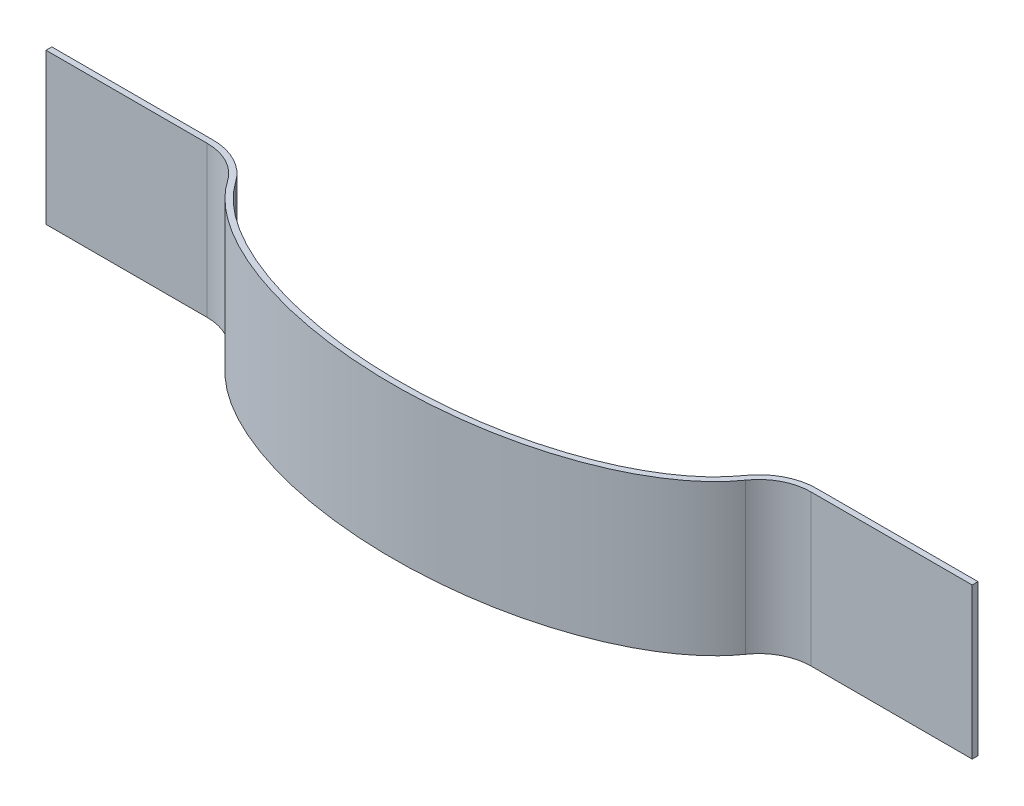
ISO-10303-21;
HEADER;
FILE_DESCRIPTION(('STEP AP214'),'2;1');
FILE_NAME('part.step','',(''),(''),'','','');
FILE_SCHEMA(('AUTOMOTIVE_DESIGN { 1 0 10303 214 1 1 1 1 }'));
ENDSEC;
DATA;
#1=APPLICATION_CONTEXT('core data for automotive mechanical design processes');
#2=APPLICATION_PROTOCOL_DEFINITION('international standard','automotive_design',2000,#1);
#3=PRODUCT_CONTEXT('',#1,'mechanical');
#4=PRODUCT('Part','Part','',(#3));
#5=PRODUCT_RELATED_PRODUCT_CATEGORY('part','',(#4));
#6=PRODUCT_DEFINITION_FORMATION('','',#4);
#7=PRODUCT_DEFINITION_CONTEXT('part definition',#1,'design');
#8=PRODUCT_DEFINITION('design','',#6,#7);
#9=PRODUCT_DEFINITION_SHAPE('','',#8);
#10=(LENGTH_UNIT() NAMED_UNIT(*) SI_UNIT(.MILLI.,.METRE.));
#11=(NAMED_UNIT(*) PLANE_ANGLE_UNIT() SI_UNIT($,.RADIAN.));
#12=(NAMED_UNIT(*) SI_UNIT($,.STERADIAN.) SOLID_ANGLE_UNIT());
#13=UNCERTAINTY_MEASURE_WITH_UNIT(LENGTH_MEASURE(1.E-05),#10,'distance_accuracy_value','');
#14=(GEOMETRIC_REPRESENTATION_CONTEXT(3) GLOBAL_UNCERTAINTY_ASSIGNED_CONTEXT((#13)) GLOBAL_UNIT_ASSIGNED_CONTEXT((#10,
#11,#12)) REPRESENTATION_CONTEXT('',''));
#15=CARTESIAN_POINT('',(0.,0.,0.));
#16=DIRECTION('',(0.,0.,1.));
#17=DIRECTION('',(1.,0.,0.));
#18=AXIS2_PLACEMENT_3D('',#15,#16,#17);
#19=CARTESIAN_POINT('',(82.8323720749977,15.9999999949704,4.99999999502958));
#20=DIRECTION('',(-1.,0.,0.));
#21=DIRECTION('',(0.,0.,1.));
#22=AXIS2_PLACEMENT_3D('',#19,#20,#21);
#23=PLANE('',#22);
#24=DIRECTION('',(0.,-1.,0.));
#25=VECTOR('',#24,1.);
#26=CARTESIAN_POINT('',(82.8323720749977,15.9999999949704,6.49999999502965));
#27=LINE('',#26,#25);
#28=CARTESIAN_POINT('',(82.8323720749977,15.9999999949704,6.49999999502965));
#29=VERTEX_POINT('',#28);
#30=CARTESIAN_POINT('',(82.8323720749977,3.,6.49999999502965));
#31=VERTEX_POINT('',#30);
#32=EDGE_CURVE('E404',#29,#31,#27,.T.);
#33=ORIENTED_EDGE('',*,*,#32,.T.);
#34=DIRECTION('',(0.,0.,-1.));
#35=VECTOR('',#34,1.);
#36=CARTESIAN_POINT('',(82.8323720749977,3.,4.99999999502958));
#37=LINE('',#36,#35);
#38=CARTESIAN_POINT('',(82.8323720749977,3.,5.99999999502962));
#39=VERTEX_POINT('',#38);
#40=EDGE_CURVE('E12',#31,#39,#37,.T.);
#41=ORIENTED_EDGE('',*,*,#40,.T.);
#42=DIRECTION('',(0.,-1.,0.));
#43=VECTOR('',#42,1.);
#44=CARTESIAN_POINT('',(82.8323720749977,15.9999999949704,5.99999999502962));
#45=LINE('',#44,#43);
#46=CARTESIAN_POINT('',(82.8323720749977,15.9999999949704,5.99999999502962));
#47=VERTEX_POINT('',#46);
#48=EDGE_CURVE('E322',#47,#39,#45,.T.);
#49=ORIENTED_EDGE('',*,*,#48,.F.);
#50=DIRECTION('',(0.,0.,-1.));
#51=VECTOR('',#50,1.);
#52=CARTESIAN_POINT('',(82.8323720749977,15.9999999949704,4.99999999502958));
#53=LINE('',#52,#51);
#54=EDGE_CURVE('E139',#29,#47,#53,.T.);
#55=ORIENTED_EDGE('',*,*,#54,.F.);
#56=EDGE_LOOP('',(#33,#41,#49,#55));
#57=FACE_BOUND('',#56,.T.);
#58=ADVANCED_FACE('F128',(#57),#23,.F.);
#59=CARTESIAN_POINT('',(3.,2.99999999999999,4.99999999502958));
#60=DIRECTION('',(1.,0.,0.));
#61=DIRECTION('',(0.,1.,0.));
#62=AXIS2_PLACEMENT_3D('',#59,#60,#61);
#63=PLANE('',#62);
#64=DIRECTION('',(0.,-1.,0.));
#65=VECTOR('',#64,1.);
#66=CARTESIAN_POINT('',(3.,15.9999999949704,6.49999999502962));
#67=LINE('',#66,#65);
#68=CARTESIAN_POINT('',(3.,15.9999999949704,6.49999999502962));
#69=VERTEX_POINT('',#68);
#70=CARTESIAN_POINT('',(3.,2.99999999999999,6.49999999502962));
#71=VERTEX_POINT('',#70);
#72=EDGE_CURVE('E399',#69,#71,#67,.T.);
#73=ORIENTED_EDGE('',*,*,#72,.F.);
#74=DIRECTION('',(0.,0.,-1.));
#75=VECTOR('',#74,1.);
#76=CARTESIAN_POINT('',(3.,15.9999999949704,4.99999999502958));
#77=LINE('',#76,#75);
#78=CARTESIAN_POINT('',(3.,15.9999999949704,5.99999999502963));
#79=VERTEX_POINT('',#78);
#80=EDGE_CURVE('E306',#69,#79,#77,.T.);
#81=ORIENTED_EDGE('',*,*,#80,.T.);
#82=DIRECTION('',(0.,-1.,0.));
#83=VECTOR('',#82,1.);
#84=CARTESIAN_POINT('',(3.,15.9999999949704,5.99999999502963));
#85=LINE('',#84,#83);
#86=CARTESIAN_POINT('',(3.,2.99999999999999,5.99999999502963));
#87=VERTEX_POINT('',#86);
#88=EDGE_CURVE('E327',#79,#87,#85,.T.);
#89=ORIENTED_EDGE('',*,*,#88,.T.);
#90=DIRECTION('',(0.,0.,-1.));
#91=VECTOR('',#90,1.);
#92=CARTESIAN_POINT('',(3.,2.99999999999999,4.99999999502958));
#93=LINE('',#92,#91);
#94=EDGE_CURVE('E304',#71,#87,#93,.T.);
#95=ORIENTED_EDGE('',*,*,#94,.F.);
#96=EDGE_LOOP('',(#73,#81,#89,#95));
#97=FACE_BOUND('',#96,.T.);
#98=ADVANCED_FACE('F263',(#97),#63,.F.);
#99=CARTESIAN_POINT('',(82.8323720749977,3.,4.99999999502958));
#100=DIRECTION('',(0.,1.,0.));
#101=DIRECTION('',(-1.,0.,0.));
#102=AXIS2_PLACEMENT_3D('',#99,#100,#101);
#103=PLANE('',#102);
#104=DIRECTION('',(-1.,0.,0.));
#105=VECTOR('',#104,1.);
#106=CARTESIAN_POINT('',(0.,2.99999999999999,6.49999999502965));
#107=LINE('',#106,#105);
#108=CARTESIAN_POINT('',(16.8897912138371,2.99999999999999,6.49999999502961));
#109=VERTEX_POINT('',#108);
#110=EDGE_CURVE('E411',#109,#71,#107,.T.);
#111=ORIENTED_EDGE('',*,*,#110,.T.);
#112=ORIENTED_EDGE('',*,*,#94,.T.);
#113=DIRECTION('',(-1.,0.,0.));
#114=VECTOR('',#113,1.);
#115=CARTESIAN_POINT('',(0.,2.99999999999999,5.99999999502965));
#116=LINE('',#115,#114);
#117=CARTESIAN_POINT('',(16.8897912138371,2.99999999999999,5.99999999502961));
#118=VERTEX_POINT('',#117);
#119=EDGE_CURVE('E289',#118,#87,#116,.T.);
#120=ORIENTED_EDGE('',*,*,#119,.F.);
#121=CARTESIAN_POINT('',(16.8897912138371,2.99999999999999,10.9999999950296));
#122=DIRECTION('',(0.,-1.,0.));
#123=DIRECTION('',(1.,0.,0.));
#124=AXIS2_PLACEMENT_3D('',#121,#122,#123);
#125=CIRCLE('',#124,5.);
#126=CARTESIAN_POINT('',(21.0089586585754,2.99999999999999,8.16584058486784));
#127=VERTEX_POINT('',#126);
#128=EDGE_CURVE('E287',#118,#127,#125,.T.);
#129=ORIENTED_EDGE('',*,*,#128,.T.);
#130=CARTESIAN_POINT('',(64.8234134214246,3.,8.16584058486781));
#131=CARTESIAN_POINT('',(64.4893561468245,3.,8.6513594463959));
#132=CARTESIAN_POINT('',(64.0672169166504,3.,9.14859964038665));
#133=CARTESIAN_POINT('',(63.0462135275658,3.,10.1387859154183));
#134=CARTESIAN_POINT('',(62.4452327473982,3.,10.6326357513184));
#135=CARTESIAN_POINT('',(61.0740177659268,3.,11.5861622791005));
#136=CARTESIAN_POINT('',(60.3033948487944,3.,12.0471155712889));
#137=CARTESIAN_POINT('',(58.6112935053986,3.,12.9102487466432));
#138=CARTESIAN_POINT('',(57.6916304043993,3.,13.3127743563693));
#139=CARTESIAN_POINT('',(55.7299462688733,3.,14.0472499679962));
#140=CARTESIAN_POINT('',(54.6879391284631,3.,14.3791371933979));
#141=CARTESIAN_POINT('',(52.5074223047549,3.,14.9573520216564));
#142=CARTESIAN_POINT('',(51.3683428039086,3.,15.2027782012598));
#143=CARTESIAN_POINT('',(47.8564976711691,3.,15.7945848496851));
#144=CARTESIAN_POINT('',(45.3876006702832,3.,15.9999999950296));
#145=CARTESIAN_POINT('',(40.4447714097168,3.,15.9999999950296));
#146=CARTESIAN_POINT('',(37.9758744088309,3.,15.7945848496851));
#147=CARTESIAN_POINT('',(34.4640292760914,3.,15.2027782012598));
#148=CARTESIAN_POINT('',(33.3249497752452,3.,14.9573520216565));
#149=CARTESIAN_POINT('',(31.1444329515369,3.,14.3791371933979));
#150=CARTESIAN_POINT('',(30.1024258111268,3.,14.0472499679963));
#151=CARTESIAN_POINT('',(28.1407416756007,3.,13.3127743563693));
#152=CARTESIAN_POINT('',(27.2210785746014,3.,12.9102487466432));
#153=CARTESIAN_POINT('',(25.5289772312057,3.,12.0471155712889));
#154=CARTESIAN_POINT('',(24.7583543140732,3.,11.5861622791005));
#155=CARTESIAN_POINT('',(23.3871393326019,3.,10.6326357513184));
#156=CARTESIAN_POINT('',(22.7861585524342,3.,10.1387859154183));
#157=CARTESIAN_POINT('',(21.7651551633497,3.,9.14859964038668));
#158=CARTESIAN_POINT('',(21.3430159331755,3.,8.65135944639593));
#159=CARTESIAN_POINT('',(21.0089586585754,3.,8.16584058486784));
#160=B_SPLINE_CURVE_WITH_KNOTS('',3,(#130,#131,#132,#133,#134,#135,#136,#137,#138,#139,#140,
#141,#142,#143,#144,#145,#146,#147,#148,#149,#150,#151,#152,#153,#154,#155,#156,#157,#158,#159),
.UNSPECIFIED.,.F.,.F.,(4,2,2,2,2,2,2,2,2,2,2,2,2,2,4),(0.,0.0624999999999999,0.125,0.1875,0.25,
0.312499999999999,0.374999999999999,0.499999999999999,0.624999999999999,0.687499999999999,
0.749999999999999,0.812499999999999,0.874999999999999,0.9375,1.),.UNSPECIFIED.);
#161=CARTESIAN_POINT('',(64.8234134214246,3.,8.16584058486782));
#162=VERTEX_POINT('',#161);
#163=EDGE_CURVE('E280',#162,#127,#160,.T.);
#164=ORIENTED_EDGE('',*,*,#163,.F.);
#165=CARTESIAN_POINT('',(68.9425808661629,3.,10.9999999950296));
#166=DIRECTION('',(0.,-1.,0.));
#167=DIRECTION('',(1.,0.,0.));
#168=AXIS2_PLACEMENT_3D('',#165,#166,#167);
#169=CIRCLE('',#168,5.);
#170=CARTESIAN_POINT('',(68.9425808661629,3.,5.99999999502959));
#171=VERTEX_POINT('',#170);
#172=EDGE_CURVE('E284',#162,#171,#169,.T.);
#173=ORIENTED_EDGE('',*,*,#172,.T.);
#174=DIRECTION('',(-1.,0.,0.));
#175=VECTOR('',#174,1.);
#176=CARTESIAN_POINT('',(0.,2.99999999999999,5.99999999502933));
#177=LINE('',#176,#175);
#178=EDGE_CURVE('E369',#39,#171,#177,.T.);
#179=ORIENTED_EDGE('',*,*,#178,.F.);
#180=ORIENTED_EDGE('',*,*,#40,.F.);
#181=DIRECTION('',(-1.,0.,0.));
#182=VECTOR('',#181,1.);
#183=CARTESIAN_POINT('',(0.,2.99999999999999,6.49999999502933));
#184=LINE('',#183,#182);
#185=CARTESIAN_POINT('',(68.9425808661629,3.,6.49999999502959));
#186=VERTEX_POINT('',#185);
#187=EDGE_CURVE('E413',#31,#186,#184,.T.);
#188=ORIENTED_EDGE('',*,*,#187,.T.);
#189=CARTESIAN_POINT('',(68.9425808661629,3.,10.9999999950296));
#190=DIRECTION('',(0.,-1.,0.));
#191=DIRECTION('',(1.,0.,0.));
#192=AXIS2_PLACEMENT_3D('',#189,#190,#191);
#193=CIRCLE('',#192,4.49999999999999);
#194=CARTESIAN_POINT('',(65.2353301658984,3.,8.449256525884));
#195=VERTEX_POINT('',#194);
#196=EDGE_CURVE('E416',#195,#186,#193,.T.);
#197=ORIENTED_EDGE('',*,*,#196,.F.);
#198=CARTESIAN_POINT('',(20.5970419141015,3.,8.44925652588401));
#199=CARTESIAN_POINT('',(20.9518703729945,3.,8.96496422782138));
#200=CARTESIAN_POINT('',(21.3958933352626,3.,9.48700047676519));
#201=CARTESIAN_POINT('',(22.4592301993114,3.,10.518242468489));
#202=CARTESIAN_POINT('',(23.0815822060893,3.,11.0291632976976));
#203=CARTESIAN_POINT('',(24.4929930854853,3.,12.0106415730153));
#204=CARTESIAN_POINT('',(25.2831980795414,3.,12.4830373082159));
#205=CARTESIAN_POINT('',(27.0124641771248,3.,13.3651280551238));
#206=CARTESIAN_POINT('',(27.9491457104601,3.,13.7749356231123));
#207=CARTESIAN_POINT('',(29.9433821924721,3.,14.5215991829222));
#208=CARTESIAN_POINT('',(31.0009162999739,3.,14.8583610099948));
#209=CARTESIAN_POINT('',(33.2121516782278,3.,15.444721578542));
#210=CARTESIAN_POINT('',(34.3665331655065,3.,15.693398240126));
#211=CARTESIAN_POINT('',(37.9216051814775,3.,16.292489366061));
#212=CARTESIAN_POINT('',(40.4170073886908,3.,16.4999999950296));
#213=CARTESIAN_POINT('',(45.4153646913092,3.,16.4999999950296));
#214=CARTESIAN_POINT('',(47.9107668985225,3.,16.292489366061));
#215=CARTESIAN_POINT('',(51.4658389144935,3.,15.693398240126));
#216=CARTESIAN_POINT('',(52.6202204017722,3.,15.444721578542));
#217=CARTESIAN_POINT('',(54.8314557800261,3.,14.8583610099948));
#218=CARTESIAN_POINT('',(55.888989887528,3.,14.5215991829222));
#219=CARTESIAN_POINT('',(57.88322636954,3.,13.7749356231123));
#220=CARTESIAN_POINT('',(58.8199079028753,3.,13.3651280551237));
#221=CARTESIAN_POINT('',(60.5491740004586,3.,12.4830373082159));
#222=CARTESIAN_POINT('',(61.3393789945147,3.,12.0106415730153));
#223=CARTESIAN_POINT('',(62.7507898739107,3.,11.0291632976975));
#224=CARTESIAN_POINT('',(63.3731418806885,3.,10.518242468489));
#225=CARTESIAN_POINT('',(64.4364787447375,3.,9.48700047676515));
#226=CARTESIAN_POINT('',(64.8805017070055,3.,8.96496422782135));
#227=CARTESIAN_POINT('',(65.2353301658985,3.,8.44925652588398));
#228=B_SPLINE_CURVE_WITH_KNOTS('',3,(#198,#199,#200,#201,#202,#203,#204,#205,#206,#207,#208,
#209,#210,#211,#212,#213,#214,#215,#216,#217,#218,#219,#220,#221,#222,#223,#224,#225,#226,#227),
.UNSPECIFIED.,.F.,.F.,(4,2,2,2,2,2,2,2,2,2,2,2,2,2,4),(0.,0.0625000000000001,0.125,0.1875,0.25,
0.3125,0.375000000000001,0.500000000000001,0.625000000000001,0.687500000000001,
0.750000000000001,0.8125,0.875,0.9375,1.),.UNSPECIFIED.);
#229=CARTESIAN_POINT('',(20.5970419141015,2.99999999999999,8.44925652588402));
#230=VERTEX_POINT('',#229);
#231=EDGE_CURVE('E228',#195,#230,#228,.F.);
#232=ORIENTED_EDGE('',*,*,#231,.T.);
#233=CARTESIAN_POINT('',(16.8897912138371,2.99999999999999,10.9999999950296));
#234=DIRECTION('',(0.,-1.,0.));
#235=DIRECTION('',(1.,0.,0.));
#236=AXIS2_PLACEMENT_3D('',#233,#234,#235);
#237=CIRCLE('',#236,4.5);
#238=EDGE_CURVE('E245',#109,#230,#237,.T.);
#239=ORIENTED_EDGE('',*,*,#238,.F.);
#240=EDGE_LOOP('',(#111,#112,#120,#129,#164,#173,#179,#180,#188,#197,#232,#239));
#241=FACE_BOUND('',#240,.T.);
#242=ADVANCED_FACE('F130',(#241),#103,.F.);
#243=CARTESIAN_POINT('',(3.,15.9999999949704,4.99999999502958));
#244=DIRECTION('',(0.,-1.,0.));
#245=DIRECTION('',(1.,0.,0.));
#246=AXIS2_PLACEMENT_3D('',#243,#244,#245);
#247=PLANE('',#246);
#248=DIRECTION('',(-1.,0.,0.));
#249=VECTOR('',#248,1.);
#250=CARTESIAN_POINT('',(0.,15.9999999949704,6.49999999502965));
#251=LINE('',#250,#249);
#252=CARTESIAN_POINT('',(16.8897912138371,15.9999999949704,6.49999999502961));
#253=VERTEX_POINT('',#252);
#254=EDGE_CURVE('E406',#253,#69,#251,.T.);
#255=ORIENTED_EDGE('',*,*,#254,.F.);
#256=CARTESIAN_POINT('',(16.8897912138371,15.9999999949704,10.9999999950296));
#257=DIRECTION('',(0.,-1.,0.));
#258=DIRECTION('',(1.,0.,0.));
#259=AXIS2_PLACEMENT_3D('',#256,#257,#258);
#260=CIRCLE('',#259,4.5);
#261=CARTESIAN_POINT('',(20.5970419141015,15.9999999949704,8.44925652588402));
#262=VERTEX_POINT('',#261);
#263=EDGE_CURVE('E231',#253,#262,#260,.T.);
#264=ORIENTED_EDGE('',*,*,#263,.T.);
#265=CARTESIAN_POINT('',(65.2353301658985,15.9999999949704,8.44925652588398));
#266=CARTESIAN_POINT('',(64.8805017070055,15.9999999949704,8.96496422782135));
#267=CARTESIAN_POINT('',(64.4364787447375,15.9999999949704,9.48700047676515));
#268=CARTESIAN_POINT('',(63.3731418806885,15.9999999949704,10.518242468489));
#269=CARTESIAN_POINT('',(62.7507898739107,15.9999999949704,11.0291632976975));
#270=CARTESIAN_POINT('',(61.3393789945147,15.9999999949704,12.0106415730153));
#271=CARTESIAN_POINT('',(60.5491740004586,15.9999999949704,12.4830373082159));
#272=CARTESIAN_POINT('',(58.8199079028753,15.9999999949704,13.3651280551237));
#273=CARTESIAN_POINT('',(57.88322636954,15.9999999949704,13.7749356231123));
#274=CARTESIAN_POINT('',(55.888989887528,15.9999999949704,14.5215991829222));
#275=CARTESIAN_POINT('',(54.8314557800261,15.9999999949704,14.8583610099948));
#276=CARTESIAN_POINT('',(52.6202204017722,15.9999999949704,15.444721578542));
#277=CARTESIAN_POINT('',(51.4658389144935,15.9999999949704,15.693398240126));
#278=CARTESIAN_POINT('',(47.9107668985225,15.9999999949704,16.292489366061));
#279=CARTESIAN_POINT('',(45.4153646913092,15.9999999949704,16.4999999950296));
#280=CARTESIAN_POINT('',(40.4170073886908,15.9999999949704,16.4999999950296));
#281=CARTESIAN_POINT('',(37.9216051814775,15.9999999949704,16.292489366061));
#282=CARTESIAN_POINT('',(34.3665331655065,15.9999999949704,15.693398240126));
#283=CARTESIAN_POINT('',(33.2121516782278,15.9999999949704,15.444721578542));
#284=CARTESIAN_POINT('',(31.0009162999739,15.9999999949704,14.8583610099948));
#285=CARTESIAN_POINT('',(29.9433821924721,15.9999999949704,14.5215991829222));
#286=CARTESIAN_POINT('',(27.9491457104601,15.9999999949704,13.7749356231123));
#287=CARTESIAN_POINT('',(27.0124641771248,15.9999999949704,13.3651280551238));
#288=CARTESIAN_POINT('',(25.2831980795414,15.9999999949704,12.4830373082159));
#289=CARTESIAN_POINT('',(24.4929930854853,15.9999999949704,12.0106415730153));
#290=CARTESIAN_POINT('',(23.0815822060893,15.9999999949704,11.0291632976976));
#291=CARTESIAN_POINT('',(22.4592301993114,15.9999999949704,10.518242468489));
#292=CARTESIAN_POINT('',(21.3958933352626,15.9999999949704,9.48700047676519));
#293=CARTESIAN_POINT('',(20.9518703729945,15.9999999949704,8.96496422782138));
#294=CARTESIAN_POINT('',(20.5970419141015,15.9999999949704,8.44925652588401));
#295=B_SPLINE_CURVE_WITH_KNOTS('',3,(#265,#266,#267,#268,#269,#270,#271,#272,#273,#274,#275,
#276,#277,#278,#279,#280,#281,#282,#283,#284,#285,#286,#287,#288,#289,#290,#291,#292,#293,#294),
.UNSPECIFIED.,.F.,.F.,(4,2,2,2,2,2,2,2,2,2,2,2,2,2,4),(0.,0.0624999999999999,0.125,0.1875,
0.249999999999999,0.312499999999999,0.374999999999999,0.499999999999999,0.624999999999999,
0.6875,0.75,0.8125,0.875,0.9375,1.),.UNSPECIFIED.);
#296=CARTESIAN_POINT('',(65.2353301658984,15.9999999949704,8.449256525884));
#297=VERTEX_POINT('',#296);
#298=EDGE_CURVE('E224',#297,#262,#295,.T.);
#299=ORIENTED_EDGE('',*,*,#298,.F.);
#300=CARTESIAN_POINT('',(68.9425808661629,15.9999999949704,10.9999999950296));
#301=DIRECTION('',(0.,-1.,0.));
#302=DIRECTION('',(1.,0.,0.));
#303=AXIS2_PLACEMENT_3D('',#300,#301,#302);
#304=CIRCLE('',#303,4.49999999999999);
#305=CARTESIAN_POINT('',(68.9425808661629,15.9999999949703,6.49999999502959));
#306=VERTEX_POINT('',#305);
#307=EDGE_CURVE('E234',#297,#306,#304,.T.);
#308=ORIENTED_EDGE('',*,*,#307,.T.);
#309=DIRECTION('',(-1.,0.,0.));
#310=VECTOR('',#309,1.);
#311=CARTESIAN_POINT('',(0.,15.9999999949704,6.49999999502933));
#312=LINE('',#311,#310);
#313=EDGE_CURVE('E238',#29,#306,#312,.T.);
#314=ORIENTED_EDGE('',*,*,#313,.F.);
#315=ORIENTED_EDGE('',*,*,#54,.T.);
#316=DIRECTION('',(-1.,0.,0.));
#317=VECTOR('',#316,1.);
#318=CARTESIAN_POINT('',(0.,15.9999999949704,5.99999999502933));
#319=LINE('',#318,#317);
#320=CARTESIAN_POINT('',(68.9425808661629,15.9999999949704,5.99999999502959));
#321=VERTEX_POINT('',#320);
#322=EDGE_CURVE('E313',#47,#321,#319,.T.);
#323=ORIENTED_EDGE('',*,*,#322,.T.);
#324=CARTESIAN_POINT('',(68.9425808661629,15.9999999949704,10.9999999950296));
#325=DIRECTION('',(0.,-1.,0.));
#326=DIRECTION('',(1.,0.,0.));
#327=AXIS2_PLACEMENT_3D('',#324,#325,#326);
#328=CIRCLE('',#327,5.);
#329=CARTESIAN_POINT('',(64.8234134214246,15.9999999949704,8.16584058486782));
#330=VERTEX_POINT('',#329);
#331=EDGE_CURVE('E370',#330,#321,#328,.T.);
#332=ORIENTED_EDGE('',*,*,#331,.F.);
#333=CARTESIAN_POINT('',(21.0089586585754,15.9999999949704,8.16584058486784));
#334=CARTESIAN_POINT('',(21.3430159331755,15.9999999949704,8.65135944639593));
#335=CARTESIAN_POINT('',(21.7651551633497,15.9999999949704,9.14859964038668));
#336=CARTESIAN_POINT('',(22.7861585524342,15.9999999949704,10.1387859154183));
#337=CARTESIAN_POINT('',(23.3871393326019,15.9999999949704,10.6326357513184));
#338=CARTESIAN_POINT('',(24.7583543140732,15.9999999949704,11.5861622791005));
#339=CARTESIAN_POINT('',(25.5289772312057,15.9999999949704,12.0471155712889));
#340=CARTESIAN_POINT('',(27.2210785746014,15.9999999949704,12.9102487466432));
#341=CARTESIAN_POINT('',(28.1407416756007,15.9999999949704,13.3127743563693));
#342=CARTESIAN_POINT('',(30.1024258111268,15.9999999949704,14.0472499679963));
#343=CARTESIAN_POINT('',(31.1444329515369,15.9999999949704,14.3791371933979));
#344=CARTESIAN_POINT('',(33.3249497752452,15.9999999949704,14.9573520216565));
#345=CARTESIAN_POINT('',(34.4640292760914,15.9999999949704,15.2027782012598));
#346=CARTESIAN_POINT('',(37.9758744088309,15.9999999949704,15.7945848496851));
#347=CARTESIAN_POINT('',(40.4447714097168,15.9999999949704,15.9999999950296));
#348=CARTESIAN_POINT('',(45.3876006702832,15.9999999949704,15.9999999950296));
#349=CARTESIAN_POINT('',(47.8564976711691,15.9999999949704,15.7945848496851));
#350=CARTESIAN_POINT('',(51.3683428039086,15.9999999949704,15.2027782012598));
#351=CARTESIAN_POINT('',(52.5074223047549,15.9999999949704,14.9573520216564));
#352=CARTESIAN_POINT('',(54.6879391284631,15.9999999949704,14.3791371933979));
#353=CARTESIAN_POINT('',(55.7299462688733,15.9999999949704,14.0472499679962));
#354=CARTESIAN_POINT('',(57.6916304043993,15.9999999949704,13.3127743563693));
#355=CARTESIAN_POINT('',(58.6112935053986,15.9999999949704,12.9102487466432));
#356=CARTESIAN_POINT('',(60.3033948487944,15.9999999949704,12.0471155712889));
#357=CARTESIAN_POINT('',(61.0740177659268,15.9999999949704,11.5861622791005));
#358=CARTESIAN_POINT('',(62.4452327473982,15.9999999949704,10.6326357513184));
#359=CARTESIAN_POINT('',(63.0462135275658,15.9999999949704,10.1387859154183));
#360=CARTESIAN_POINT('',(64.0672169166504,15.9999999949704,9.14859964038665));
#361=CARTESIAN_POINT('',(64.4893561468245,15.9999999949704,8.6513594463959));
#362=CARTESIAN_POINT('',(64.8234134214246,15.9999999949704,8.16584058486781));
#363=B_SPLINE_CURVE_WITH_KNOTS('',3,(#333,#334,#335,#336,#337,#338,#339,#340,#341,#342,#343,
#344,#345,#346,#347,#348,#349,#350,#351,#352,#353,#354,#355,#356,#357,#358,#359,#360,#361,#362),
.UNSPECIFIED.,.F.,.F.,(4,2,2,2,2,2,2,2,2,2,2,2,2,2,4),(0.,0.0625000000000003,0.125000000000001,
0.187500000000001,0.250000000000001,0.312500000000001,0.375000000000001,0.500000000000001,
0.625000000000001,0.687500000000001,0.75,0.8125,0.875,0.9375,1.),.UNSPECIFIED.);
#364=CARTESIAN_POINT('',(21.0089586585754,15.9999999949704,8.16584058486784));
#365=VERTEX_POINT('',#364);
#366=EDGE_CURVE('E337',#330,#365,#363,.F.);
#367=ORIENTED_EDGE('',*,*,#366,.T.);
#368=CARTESIAN_POINT('',(16.8897912138371,15.9999999949704,10.9999999950296));
#369=DIRECTION('',(0.,-1.,0.));
#370=DIRECTION('',(1.,0.,0.));
#371=AXIS2_PLACEMENT_3D('',#368,#369,#370);
#372=CIRCLE('',#371,5.);
#373=CARTESIAN_POINT('',(16.8897912138371,15.9999999949704,5.99999999502961));
#374=VERTEX_POINT('',#373);
#375=EDGE_CURVE('E366',#374,#365,#372,.T.);
#376=ORIENTED_EDGE('',*,*,#375,.F.);
#377=DIRECTION('',(-1.,0.,0.));
#378=VECTOR('',#377,1.);
#379=CARTESIAN_POINT('',(0.,15.9999999949704,5.99999999502965));
#380=LINE('',#379,#378);
#381=EDGE_CURVE('E324',#374,#79,#380,.T.);
#382=ORIENTED_EDGE('',*,*,#381,.T.);
#383=ORIENTED_EDGE('',*,*,#80,.F.);
#384=EDGE_LOOP('',(#255,#264,#299,#308,#314,#315,#323,#332,#367,#376,#382,#383));
#385=FACE_BOUND('',#384,.T.);
#386=ADVANCED_FACE('F243',(#385),#247,.F.);
#387=CARTESIAN_POINT('',(68.9425808661629,15.9999999949704,10.9999999950296));
#388=DIRECTION('',(0.,-1.,0.));
#389=DIRECTION('',(1.,0.,0.));
#390=AXIS2_PLACEMENT_3D('',#387,#388,#389);
#391=CYLINDRICAL_SURFACE('',#390,5.);
#392=ORIENTED_EDGE('',*,*,#172,.F.);
#393=DIRECTION('',(0.,-1.,0.));
#394=VECTOR('',#393,1.);
#395=CARTESIAN_POINT('',(64.8234134214246,15.9999999949704,8.16584058486782));
#396=LINE('',#395,#394);
#397=EDGE_CURVE('E323',#330,#162,#396,.T.);
#398=ORIENTED_EDGE('',*,*,#397,.F.);
#399=ORIENTED_EDGE('',*,*,#331,.T.);
#400=DIRECTION('',(0.,-1.,0.));
#401=VECTOR('',#400,1.);
#402=CARTESIAN_POINT('',(68.9425808661629,15.9999999949704,5.99999999502959));
#403=LINE('',#402,#401);
#404=EDGE_CURVE('E307',#321,#171,#403,.T.);
#405=ORIENTED_EDGE('',*,*,#404,.T.);
#406=EDGE_LOOP('',(#392,#398,#399,#405));
#407=FACE_BOUND('',#406,.T.);
#408=ADVANCED_FACE('F262',(#407),#391,.T.);
#409=CARTESIAN_POINT('',(0.,15.9999999949704,5.99999999502933));
#410=DIRECTION('',(0.,0.,1.));
#411=DIRECTION('',(1.,0.,0.));
#412=AXIS2_PLACEMENT_3D('',#409,#410,#411);
#413=PLANE('',#412);
#414=ORIENTED_EDGE('',*,*,#178,.T.);
#415=ORIENTED_EDGE('',*,*,#404,.F.);
#416=ORIENTED_EDGE('',*,*,#322,.F.);
#417=ORIENTED_EDGE('',*,*,#48,.T.);
#418=EDGE_LOOP('',(#414,#415,#416,#417));
#419=FACE_BOUND('',#418,.T.);
#420=ADVANCED_FACE('F321',(#419),#413,.F.);
#421=CARTESIAN_POINT('',(0.,15.9999999949704,5.99999999502965));
#422=DIRECTION('',(0.,0.,1.));
#423=DIRECTION('',(1.,0.,0.));
#424=AXIS2_PLACEMENT_3D('',#421,#422,#423);
#425=PLANE('',#424);
#426=ORIENTED_EDGE('',*,*,#119,.T.);
#427=ORIENTED_EDGE('',*,*,#88,.F.);
#428=ORIENTED_EDGE('',*,*,#381,.F.);
#429=DIRECTION('',(0.,-1.,0.));
#430=VECTOR('',#429,1.);
#431=CARTESIAN_POINT('',(16.8897912138371,15.9999999949704,5.99999999502961));
#432=LINE('',#431,#430);
#433=EDGE_CURVE('E331',#374,#118,#432,.T.);
#434=ORIENTED_EDGE('',*,*,#433,.T.);
#435=EDGE_LOOP('',(#426,#427,#428,#434));
#436=FACE_BOUND('',#435,.T.);
#437=ADVANCED_FACE('F387',(#436),#425,.F.);
#438=CARTESIAN_POINT('',(16.8897912138371,15.9999999949704,10.9999999950296));
#439=DIRECTION('',(0.,-1.,0.));
#440=DIRECTION('',(1.,0.,0.));
#441=AXIS2_PLACEMENT_3D('',#438,#439,#440);
#442=CYLINDRICAL_SURFACE('',#441,5.);
#443=ORIENTED_EDGE('',*,*,#128,.F.);
#444=ORIENTED_EDGE('',*,*,#433,.F.);
#445=ORIENTED_EDGE('',*,*,#375,.T.);
#446=DIRECTION('',(0.,-1.,0.));
#447=VECTOR('',#446,1.);
#448=CARTESIAN_POINT('',(21.0089586585754,15.9999999949704,8.16584058486784));
#449=LINE('',#448,#447);
#450=EDGE_CURVE('E155',#365,#127,#449,.T.);
#451=ORIENTED_EDGE('',*,*,#450,.T.);
#452=EDGE_LOOP('',(#443,#444,#445,#451));
#453=FACE_BOUND('',#452,.T.);
#454=ADVANCED_FACE('F352',(#453),#442,.T.);
#455=CARTESIAN_POINT('',(64.8234134214246,15.9999999949704,8.16584058486781));
#456=CARTESIAN_POINT('',(64.4893561468245,15.9999999949704,8.6513594463959));
#457=CARTESIAN_POINT('',(64.0672169166504,15.9999999949704,9.14859964038665));
#458=CARTESIAN_POINT('',(63.0462135275658,15.9999999949704,10.1387859154183));
#459=CARTESIAN_POINT('',(62.4452327473982,15.9999999949704,10.6326357513184));
#460=CARTESIAN_POINT('',(61.0740177659268,15.9999999949704,11.5861622791005));
#461=CARTESIAN_POINT('',(60.3033948487944,15.9999999949704,12.0471155712889));
#462=CARTESIAN_POINT('',(58.6112935053986,15.9999999949704,12.9102487466432));
#463=CARTESIAN_POINT('',(57.6916304043993,15.9999999949704,13.3127743563693));
#464=CARTESIAN_POINT('',(55.7299462688733,15.9999999949704,14.0472499679962));
#465=CARTESIAN_POINT('',(54.6879391284631,15.9999999949704,14.3791371933979));
#466=CARTESIAN_POINT('',(52.5074223047549,15.9999999949704,14.9573520216564));
#467=CARTESIAN_POINT('',(51.3683428039086,15.9999999949704,15.2027782012598));
#468=CARTESIAN_POINT('',(47.8564976711691,15.9999999949704,15.7945848496851));
#469=CARTESIAN_POINT('',(45.3876006702832,15.9999999949704,15.9999999950296));
#470=CARTESIAN_POINT('',(40.4447714097168,15.9999999949704,15.9999999950296));
#471=CARTESIAN_POINT('',(37.9758744088309,15.9999999949704,15.7945848496851));
#472=CARTESIAN_POINT('',(34.4640292760914,15.9999999949704,15.2027782012598));
#473=CARTESIAN_POINT('',(33.3249497752452,15.9999999949704,14.9573520216565));
#474=CARTESIAN_POINT('',(31.1444329515369,15.9999999949704,14.3791371933979));
#475=CARTESIAN_POINT('',(30.1024258111268,15.9999999949704,14.0472499679963));
#476=CARTESIAN_POINT('',(28.1407416756007,15.9999999949704,13.3127743563693));
#477=CARTESIAN_POINT('',(27.2210785746014,15.9999999949704,12.9102487466432));
#478=CARTESIAN_POINT('',(25.5289772312057,15.9999999949704,12.0471155712889));
#479=CARTESIAN_POINT('',(24.7583543140732,15.9999999949704,11.5861622791005));
#480=CARTESIAN_POINT('',(23.3871393326019,15.9999999949704,10.6326357513184));
#481=CARTESIAN_POINT('',(22.7861585524342,15.9999999949704,10.1387859154183));
#482=CARTESIAN_POINT('',(21.7651551633497,15.9999999949704,9.14859964038668));
#483=CARTESIAN_POINT('',(21.3430159331755,15.9999999949704,8.65135944639593));
#484=CARTESIAN_POINT('',(21.0089586585754,15.9999999949704,8.16584058486784));
#485=B_SPLINE_CURVE_WITH_KNOTS('',3,(#455,#456,#457,#458,#459,#460,#461,#462,#463,#464,#465,
#466,#467,#468,#469,#470,#471,#472,#473,#474,#475,#476,#477,#478,#479,#480,#481,#482,#483,#484),
.UNSPECIFIED.,.F.,.F.,(4,2,2,2,2,2,2,2,2,2,2,2,2,2,4),(0.,0.0624999999999999,0.125,0.1875,0.25,
0.312499999999999,0.374999999999999,0.499999999999999,0.624999999999999,0.687499999999999,
0.749999999999999,0.812499999999999,0.874999999999999,0.9375,1.),.UNSPECIFIED.);
#486=DIRECTION('',(0.,-1.,0.));
#487=VECTOR('',#486,1.);
#488=SURFACE_OF_LINEAR_EXTRUSION('',#485,#487);
#489=ORIENTED_EDGE('',*,*,#163,.T.);
#490=ORIENTED_EDGE('',*,*,#450,.F.);
#491=ORIENTED_EDGE('',*,*,#366,.F.);
#492=ORIENTED_EDGE('',*,*,#397,.T.);
#493=EDGE_LOOP('',(#489,#490,#491,#492));
#494=FACE_BOUND('',#493,.T.);
#495=ADVANCED_FACE('F342',(#494),#488,.F.);
#496=CARTESIAN_POINT('',(65.2353301658985,15.9999999949704,8.44925652588398));
#497=CARTESIAN_POINT('',(64.8805017070055,15.9999999949704,8.96496422782135));
#498=CARTESIAN_POINT('',(64.4364787447375,15.9999999949704,9.48700047676515));
#499=CARTESIAN_POINT('',(63.3731418806885,15.9999999949704,10.518242468489));
#500=CARTESIAN_POINT('',(62.7507898739107,15.9999999949704,11.0291632976975));
#501=CARTESIAN_POINT('',(61.3393789945147,15.9999999949704,12.0106415730153));
#502=CARTESIAN_POINT('',(60.5491740004586,15.9999999949704,12.4830373082159));
#503=CARTESIAN_POINT('',(58.8199079028753,15.9999999949704,13.3651280551237));
#504=CARTESIAN_POINT('',(57.88322636954,15.9999999949704,13.7749356231123));
#505=CARTESIAN_POINT('',(55.888989887528,15.9999999949704,14.5215991829222));
#506=CARTESIAN_POINT('',(54.8314557800261,15.9999999949704,14.8583610099948));
#507=CARTESIAN_POINT('',(52.6202204017722,15.9999999949704,15.444721578542));
#508=CARTESIAN_POINT('',(51.4658389144935,15.9999999949704,15.693398240126));
#509=CARTESIAN_POINT('',(47.9107668985225,15.9999999949704,16.292489366061));
#510=CARTESIAN_POINT('',(45.4153646913092,15.9999999949704,16.4999999950296));
#511=CARTESIAN_POINT('',(40.4170073886908,15.9999999949704,16.4999999950296));
#512=CARTESIAN_POINT('',(37.9216051814775,15.9999999949704,16.292489366061));
#513=CARTESIAN_POINT('',(34.3665331655065,15.9999999949704,15.693398240126));
#514=CARTESIAN_POINT('',(33.2121516782278,15.9999999949704,15.444721578542));
#515=CARTESIAN_POINT('',(31.0009162999739,15.9999999949704,14.8583610099948));
#516=CARTESIAN_POINT('',(29.9433821924721,15.9999999949704,14.5215991829222));
#517=CARTESIAN_POINT('',(27.9491457104601,15.9999999949704,13.7749356231123));
#518=CARTESIAN_POINT('',(27.0124641771248,15.9999999949704,13.3651280551238));
#519=CARTESIAN_POINT('',(25.2831980795414,15.9999999949704,12.4830373082159));
#520=CARTESIAN_POINT('',(24.4929930854853,15.9999999949704,12.0106415730153));
#521=CARTESIAN_POINT('',(23.0815822060893,15.9999999949704,11.0291632976976));
#522=CARTESIAN_POINT('',(22.4592301993114,15.9999999949704,10.518242468489));
#523=CARTESIAN_POINT('',(21.3958933352626,15.9999999949704,9.48700047676519));
#524=CARTESIAN_POINT('',(20.9518703729945,15.9999999949704,8.96496422782138));
#525=CARTESIAN_POINT('',(20.5970419141015,15.9999999949704,8.44925652588401));
#526=B_SPLINE_CURVE_WITH_KNOTS('',3,(#496,#497,#498,#499,#500,#501,#502,#503,#504,#505,#506,
#507,#508,#509,#510,#511,#512,#513,#514,#515,#516,#517,#518,#519,#520,#521,#522,#523,#524,#525),
.UNSPECIFIED.,.F.,.F.,(4,2,2,2,2,2,2,2,2,2,2,2,2,2,4),(0.,0.0624999999999999,0.125,0.1875,
0.249999999999999,0.312499999999999,0.374999999999999,0.499999999999999,0.624999999999999,
0.6875,0.75,0.8125,0.875,0.9375,1.),.UNSPECIFIED.);
#527=DIRECTION('',(0.,-1.,0.));
#528=VECTOR('',#527,1.);
#529=SURFACE_OF_LINEAR_EXTRUSION('',#526,#528);
#530=ORIENTED_EDGE('',*,*,#231,.F.);
#531=DIRECTION('',(0.,-1.,0.));
#532=VECTOR('',#531,1.);
#533=CARTESIAN_POINT('',(65.2353301658984,15.9999999949704,8.449256525884));
#534=LINE('',#533,#532);
#535=EDGE_CURVE('E221',#297,#195,#534,.T.);
#536=ORIENTED_EDGE('',*,*,#535,.F.);
#537=ORIENTED_EDGE('',*,*,#298,.T.);
#538=DIRECTION('',(0.,-1.,0.));
#539=VECTOR('',#538,1.);
#540=CARTESIAN_POINT('',(20.5970419141015,15.9999999949704,8.44925652588402));
#541=LINE('',#540,#539);
#542=EDGE_CURVE('E291',#262,#230,#541,.T.);
#543=ORIENTED_EDGE('',*,*,#542,.T.);
#544=EDGE_LOOP('',(#530,#536,#537,#543));
#545=FACE_BOUND('',#544,.T.);
#546=ADVANCED_FACE('F222',(#545),#529,.T.);
#547=CARTESIAN_POINT('',(16.8897912138371,15.9999999949704,10.9999999950296));
#548=DIRECTION('',(0.,-1.,0.));
#549=DIRECTION('',(1.,0.,0.));
#550=AXIS2_PLACEMENT_3D('',#547,#548,#549);
#551=CYLINDRICAL_SURFACE('',#550,4.5);
#552=ORIENTED_EDGE('',*,*,#238,.T.);
#553=ORIENTED_EDGE('',*,*,#542,.F.);
#554=ORIENTED_EDGE('',*,*,#263,.F.);
#555=DIRECTION('',(0.,-1.,0.));
#556=VECTOR('',#555,1.);
#557=CARTESIAN_POINT('',(16.8897912138371,15.9999999949704,6.49999999502961));
#558=LINE('',#557,#556);
#559=EDGE_CURVE('E293',#253,#109,#558,.T.);
#560=ORIENTED_EDGE('',*,*,#559,.T.);
#561=EDGE_LOOP('',(#552,#553,#554,#560));
#562=FACE_BOUND('',#561,.T.);
#563=ADVANCED_FACE('F436',(#562),#551,.F.);
#564=CARTESIAN_POINT('',(0.,15.9999999949704,6.49999999502965));
#565=DIRECTION('',(0.,0.,1.));
#566=DIRECTION('',(1.,0.,0.));
#567=AXIS2_PLACEMENT_3D('',#564,#565,#566);
#568=PLANE('',#567);
#569=ORIENTED_EDGE('',*,*,#110,.F.);
#570=ORIENTED_EDGE('',*,*,#559,.F.);
#571=ORIENTED_EDGE('',*,*,#254,.T.);
#572=ORIENTED_EDGE('',*,*,#72,.T.);
#573=EDGE_LOOP('',(#569,#570,#571,#572));
#574=FACE_BOUND('',#573,.T.);
#575=ADVANCED_FACE('F465',(#574),#568,.T.);
#576=CARTESIAN_POINT('',(0.,15.9999999949704,6.49999999502933));
#577=DIRECTION('',(0.,0.,1.));
#578=DIRECTION('',(1.,0.,0.));
#579=AXIS2_PLACEMENT_3D('',#576,#577,#578);
#580=PLANE('',#579);
#581=ORIENTED_EDGE('',*,*,#187,.F.);
#582=ORIENTED_EDGE('',*,*,#32,.F.);
#583=ORIENTED_EDGE('',*,*,#313,.T.);
#584=DIRECTION('',(0.,-1.,0.));
#585=VECTOR('',#584,1.);
#586=CARTESIAN_POINT('',(68.9425808661629,15.9999999949704,6.49999999502959));
#587=LINE('',#586,#585);
#588=EDGE_CURVE('E147',#306,#186,#587,.T.);
#589=ORIENTED_EDGE('',*,*,#588,.T.);
#590=EDGE_LOOP('',(#581,#582,#583,#589));
#591=FACE_BOUND('',#590,.T.);
#592=ADVANCED_FACE('F463',(#591),#580,.T.);
#593=CARTESIAN_POINT('',(68.9425808661629,15.9999999949704,10.9999999950296));
#594=DIRECTION('',(0.,-1.,0.));
#595=DIRECTION('',(1.,0.,0.));
#596=AXIS2_PLACEMENT_3D('',#593,#594,#595);
#597=CYLINDRICAL_SURFACE('',#596,4.49999999999999);
#598=ORIENTED_EDGE('',*,*,#196,.T.);
#599=ORIENTED_EDGE('',*,*,#588,.F.);
#600=ORIENTED_EDGE('',*,*,#307,.F.);
#601=ORIENTED_EDGE('',*,*,#535,.T.);
#602=EDGE_LOOP('',(#598,#599,#600,#601));
#603=FACE_BOUND('',#602,.T.);
#604=ADVANCED_FACE('F235',(#603),#597,.F.);
#605=CLOSED_SHELL('',(#58,#98,#242,#386,#408,#420,#437,#454,#495,#546,#563,#575,#592,#604));
#606=MANIFOLD_SOLID_BREP('B2',#605);
#607=ADVANCED_BREP_SHAPE_REPRESENTATION('',(#18,#606),#14);
#608=SHAPE_DEFINITION_REPRESENTATION(#9,#607);
ENDSEC;
END-ISO-10303-21;
